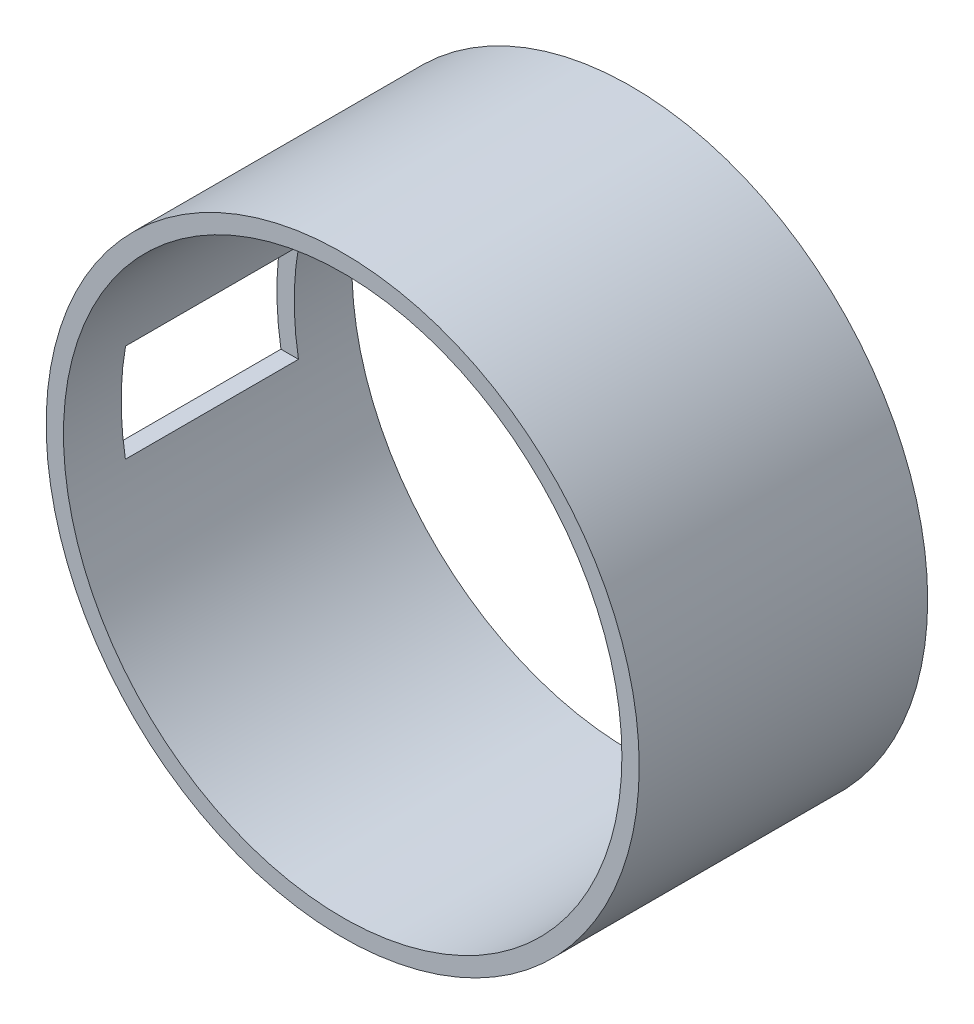
ISO-10303-21;
HEADER;
FILE_DESCRIPTION(('STEP AP214'),'2;1');
FILE_NAME('part.step','',(''),(''),'','','');
FILE_SCHEMA(('AUTOMOTIVE_DESIGN { 1 0 10303 214 1 1 1 1 }'));
ENDSEC;
DATA;
#1=APPLICATION_CONTEXT('core data for automotive mechanical design processes');
#2=APPLICATION_PROTOCOL_DEFINITION('international standard','automotive_design',2000,#1);
#3=PRODUCT_CONTEXT('',#1,'mechanical');
#4=PRODUCT('Part','Part','',(#3));
#5=PRODUCT_RELATED_PRODUCT_CATEGORY('part','',(#4));
#6=PRODUCT_DEFINITION_FORMATION('','',#4);
#7=PRODUCT_DEFINITION_CONTEXT('part definition',#1,'design');
#8=PRODUCT_DEFINITION('design','',#6,#7);
#9=PRODUCT_DEFINITION_SHAPE('','',#8);
#10=(LENGTH_UNIT() NAMED_UNIT(*) SI_UNIT(.MILLI.,.METRE.));
#11=(NAMED_UNIT(*) PLANE_ANGLE_UNIT() SI_UNIT($,.RADIAN.));
#12=(NAMED_UNIT(*) SI_UNIT($,.STERADIAN.) SOLID_ANGLE_UNIT());
#13=UNCERTAINTY_MEASURE_WITH_UNIT(LENGTH_MEASURE(1.E-05),#10,'distance_accuracy_value','');
#14=(GEOMETRIC_REPRESENTATION_CONTEXT(3) GLOBAL_UNCERTAINTY_ASSIGNED_CONTEXT((#13)) GLOBAL_UNIT_ASSIGNED_CONTEXT((#10,
#11,#12)) REPRESENTATION_CONTEXT('',''));
#15=CARTESIAN_POINT('',(0.,0.,0.));
#16=DIRECTION('',(0.,0.,1.));
#17=DIRECTION('',(1.,0.,0.));
#18=AXIS2_PLACEMENT_3D('',#15,#16,#17);
#19=CARTESIAN_POINT('',(0.,0.,10.));
#20=DIRECTION('',(0.,0.,1.));
#21=DIRECTION('',(1.,0.,0.));
#22=AXIS2_PLACEMENT_3D('',#19,#20,#21);
#23=PLANE('',#22);
#24=CARTESIAN_POINT('',(0.,0.,10.));
#25=DIRECTION('',(0.,0.,1.));
#26=DIRECTION('',(1.,0.,0.));
#27=AXIS2_PLACEMENT_3D('',#24,#25,#26);
#28=CIRCLE('',#27,10.28);
#29=CARTESIAN_POINT('',(10.28,0.,10.));
#30=VERTEX_POINT('',#29);
#31=EDGE_CURVE('E91',#30,#30,#28,.T.);
#32=ORIENTED_EDGE('',*,*,#31,.T.);
#33=EDGE_LOOP('',(#32));
#34=FACE_BOUND('',#33,.T.);
#35=CARTESIAN_POINT('',(0.,0.,10.));
#36=DIRECTION('',(0.,0.,1.));
#37=DIRECTION('',(1.,0.,0.));
#38=AXIS2_PLACEMENT_3D('',#35,#36,#37);
#39=CIRCLE('',#38,9.68);
#40=CARTESIAN_POINT('',(9.68,0.,10.));
#41=VERTEX_POINT('',#40);
#42=EDGE_CURVE('E115',#41,#41,#39,.T.);
#43=ORIENTED_EDGE('',*,*,#42,.F.);
#44=EDGE_LOOP('',(#43));
#45=FACE_BOUND('',#44,.T.);
#46=ADVANCED_FACE('F45',(#34,#45),#23,.T.);
#47=CARTESIAN_POINT('',(0.,0.,0.));
#48=DIRECTION('',(0.,0.,1.));
#49=DIRECTION('',(1.,0.,0.));
#50=AXIS2_PLACEMENT_3D('',#47,#48,#49);
#51=PLANE('',#50);
#52=CARTESIAN_POINT('',(0.,0.,0.));
#53=DIRECTION('',(0.,0.,1.));
#54=DIRECTION('',(1.,0.,0.));
#55=AXIS2_PLACEMENT_3D('',#52,#53,#54);
#56=CIRCLE('',#55,10.28);
#57=CARTESIAN_POINT('',(10.28,0.,0.));
#58=VERTEX_POINT('',#57);
#59=EDGE_CURVE('E111',#58,#58,#56,.T.);
#60=ORIENTED_EDGE('',*,*,#59,.F.);
#61=EDGE_LOOP('',(#60));
#62=FACE_BOUND('',#61,.T.);
#63=CARTESIAN_POINT('',(0.,0.,0.));
#64=DIRECTION('',(0.,0.,1.));
#65=DIRECTION('',(1.,0.,0.));
#66=AXIS2_PLACEMENT_3D('',#63,#64,#65);
#67=CIRCLE('',#66,9.68);
#68=CARTESIAN_POINT('',(9.68,0.,0.));
#69=VERTEX_POINT('',#68);
#70=EDGE_CURVE('E119',#69,#69,#67,.T.);
#71=ORIENTED_EDGE('',*,*,#70,.T.);
#72=EDGE_LOOP('',(#71));
#73=FACE_BOUND('',#72,.T.);
#74=ADVANCED_FACE('F160',(#62,#73),#51,.F.);
#75=CARTESIAN_POINT('',(0.,0.,10.));
#76=DIRECTION('',(0.,0.,-1.));
#77=DIRECTION('',(-1.,0.,0.));
#78=AXIS2_PLACEMENT_3D('',#75,#76,#77);
#79=CYLINDRICAL_SURFACE('',#78,10.28);
#80=DIRECTION('',(0.,0.,-1.));
#81=VECTOR('',#80,1.);
#82=CARTESIAN_POINT('',(-10.1359616319165,1.71484162426612,10.));
#83=LINE('',#82,#81);
#84=CARTESIAN_POINT('',(-10.1359616319165,1.71484162426612,2.));
#85=VERTEX_POINT('',#84);
#86=CARTESIAN_POINT('',(-10.1359616319165,1.71484162426612,8.));
#87=VERTEX_POINT('',#86);
#88=EDGE_CURVE('E128',#85,#87,#83,.F.);
#89=ORIENTED_EDGE('',*,*,#88,.T.);
#90=CARTESIAN_POINT('',(0.,0.,8.));
#91=DIRECTION('',(0.,0.,1.));
#92=DIRECTION('',(1.,0.,0.));
#93=AXIS2_PLACEMENT_3D('',#90,#91,#92);
#94=CIRCLE('',#93,10.28);
#95=CARTESIAN_POINT('',(-10.1409388741227,-1.68515837573388,8.));
#96=VERTEX_POINT('',#95);
#97=EDGE_CURVE('E132',#87,#96,#94,.T.);
#98=ORIENTED_EDGE('',*,*,#97,.T.);
#99=DIRECTION('',(0.,0.,-1.));
#100=VECTOR('',#99,1.);
#101=CARTESIAN_POINT('',(-10.1409388741227,-1.68515837573388,10.));
#102=LINE('',#101,#100);
#103=CARTESIAN_POINT('',(-10.1409388741227,-1.68515837573388,2.));
#104=VERTEX_POINT('',#103);
#105=EDGE_CURVE('E135',#96,#104,#102,.T.);
#106=ORIENTED_EDGE('',*,*,#105,.T.);
#107=CARTESIAN_POINT('',(0.,0.,2.));
#108=DIRECTION('',(0.,0.,-1.));
#109=DIRECTION('',(0.,1.,0.));
#110=AXIS2_PLACEMENT_3D('',#107,#108,#109);
#111=CIRCLE('',#110,10.28);
#112=EDGE_CURVE('E97',#104,#85,#111,.T.);
#113=ORIENTED_EDGE('',*,*,#112,.T.);
#114=EDGE_LOOP('',(#89,#98,#106,#113));
#115=FACE_BOUND('',#114,.T.);
#116=ORIENTED_EDGE('',*,*,#31,.F.);
#117=EDGE_LOOP('',(#116));
#118=FACE_BOUND('',#117,.T.);
#119=ORIENTED_EDGE('',*,*,#59,.T.);
#120=EDGE_LOOP('',(#119));
#121=FACE_BOUND('',#120,.T.);
#122=ADVANCED_FACE('F47',(#115,#118,#121),#79,.T.);
#123=CARTESIAN_POINT('',(0.,0.,10.));
#124=DIRECTION('',(0.,0.,-1.));
#125=DIRECTION('',(-1.,0.,0.));
#126=AXIS2_PLACEMENT_3D('',#123,#124,#125);
#127=CYLINDRICAL_SURFACE('',#126,9.68);
#128=CARTESIAN_POINT('',(0.,0.,2.));
#129=DIRECTION('',(0.,0.,-1.));
#130=DIRECTION('',(0.,1.,0.));
#131=AXIS2_PLACEMENT_3D('',#128,#129,#130);
#132=CIRCLE('',#131,9.68);
#133=CARTESIAN_POINT('',(-9.53218974048954,-1.68515837573388,2.));
#134=VERTEX_POINT('',#133);
#135=CARTESIAN_POINT('',(-9.52689446796197,1.71484162426612,2.));
#136=VERTEX_POINT('',#135);
#137=EDGE_CURVE('E11',#134,#136,#132,.T.);
#138=ORIENTED_EDGE('',*,*,#137,.F.);
#139=DIRECTION('',(0.,0.,-1.));
#140=VECTOR('',#139,1.);
#141=CARTESIAN_POINT('',(-9.53218974048954,-1.68515837573388,10.));
#142=LINE('',#141,#140);
#143=CARTESIAN_POINT('',(-9.53218974048954,-1.68515837573388,8.));
#144=VERTEX_POINT('',#143);
#145=EDGE_CURVE('E84',#144,#134,#142,.T.);
#146=ORIENTED_EDGE('',*,*,#145,.F.);
#147=CARTESIAN_POINT('',(0.,0.,8.));
#148=DIRECTION('',(0.,0.,1.));
#149=DIRECTION('',(1.,0.,0.));
#150=AXIS2_PLACEMENT_3D('',#147,#148,#149);
#151=CIRCLE('',#150,9.68);
#152=CARTESIAN_POINT('',(-9.52689446796197,1.71484162426612,8.));
#153=VERTEX_POINT('',#152);
#154=EDGE_CURVE('E90',#153,#144,#151,.T.);
#155=ORIENTED_EDGE('',*,*,#154,.F.);
#156=DIRECTION('',(0.,0.,-1.));
#157=VECTOR('',#156,1.);
#158=CARTESIAN_POINT('',(-9.52689446796197,1.71484162426612,10.));
#159=LINE('',#158,#157);
#160=EDGE_CURVE('E54',#136,#153,#159,.F.);
#161=ORIENTED_EDGE('',*,*,#160,.F.);
#162=EDGE_LOOP('',(#138,#146,#155,#161));
#163=FACE_BOUND('',#162,.T.);
#164=ORIENTED_EDGE('',*,*,#42,.T.);
#165=EDGE_LOOP('',(#164));
#166=FACE_BOUND('',#165,.T.);
#167=ORIENTED_EDGE('',*,*,#70,.F.);
#168=EDGE_LOOP('',(#167));
#169=FACE_BOUND('',#168,.T.);
#170=ADVANCED_FACE('F102',(#163,#166,#169),#127,.F.);
#171=CARTESIAN_POINT('',(-8.78,1.71484162426612,2.));
#172=DIRECTION('',(0.,0.,-1.));
#173=DIRECTION('',(0.,1.,0.));
#174=AXIS2_PLACEMENT_3D('',#171,#172,#173);
#175=PLANE('',#174);
#176=DIRECTION('',(-1.,0.,0.));
#177=VECTOR('',#176,1.);
#178=CARTESIAN_POINT('',(-8.78,-1.68515837573388,2.));
#179=LINE('',#178,#177);
#180=EDGE_CURVE('E61',#134,#104,#179,.T.);
#181=ORIENTED_EDGE('',*,*,#180,.F.);
#182=ORIENTED_EDGE('',*,*,#137,.T.);
#183=DIRECTION('',(-1.,0.,0.));
#184=VECTOR('',#183,1.);
#185=CARTESIAN_POINT('',(-8.78,1.71484162426612,2.));
#186=LINE('',#185,#184);
#187=EDGE_CURVE('E137',#136,#85,#186,.T.);
#188=ORIENTED_EDGE('',*,*,#187,.T.);
#189=ORIENTED_EDGE('',*,*,#112,.F.);
#190=EDGE_LOOP('',(#181,#182,#188,#189));
#191=FACE_BOUND('',#190,.T.);
#192=ADVANCED_FACE('F94',(#191),#175,.F.);
#193=CARTESIAN_POINT('',(-8.78,1.71484162426612,2.));
#194=DIRECTION('',(0.,1.,0.));
#195=DIRECTION('',(0.,0.,1.));
#196=AXIS2_PLACEMENT_3D('',#193,#194,#195);
#197=PLANE('',#196);
#198=ORIENTED_EDGE('',*,*,#187,.F.);
#199=ORIENTED_EDGE('',*,*,#160,.T.);
#200=DIRECTION('',(-1.,0.,0.));
#201=VECTOR('',#200,1.);
#202=CARTESIAN_POINT('',(-8.78,1.71484162426612,8.));
#203=LINE('',#202,#201);
#204=EDGE_CURVE('E141',#153,#87,#203,.T.);
#205=ORIENTED_EDGE('',*,*,#204,.T.);
#206=ORIENTED_EDGE('',*,*,#88,.F.);
#207=EDGE_LOOP('',(#198,#199,#205,#206));
#208=FACE_BOUND('',#207,.T.);
#209=ADVANCED_FACE('F146',(#208),#197,.F.);
#210=CARTESIAN_POINT('',(-8.78,1.71484162426612,8.));
#211=DIRECTION('',(0.,0.,1.));
#212=DIRECTION('',(1.,0.,0.));
#213=AXIS2_PLACEMENT_3D('',#210,#211,#212);
#214=PLANE('',#213);
#215=ORIENTED_EDGE('',*,*,#204,.F.);
#216=ORIENTED_EDGE('',*,*,#154,.T.);
#217=DIRECTION('',(-1.,0.,0.));
#218=VECTOR('',#217,1.);
#219=CARTESIAN_POINT('',(-8.78,-1.68515837573388,8.));
#220=LINE('',#219,#218);
#221=EDGE_CURVE('E66',#144,#96,#220,.T.);
#222=ORIENTED_EDGE('',*,*,#221,.T.);
#223=ORIENTED_EDGE('',*,*,#97,.F.);
#224=EDGE_LOOP('',(#215,#216,#222,#223));
#225=FACE_BOUND('',#224,.T.);
#226=ADVANCED_FACE('F150',(#225),#214,.F.);
#227=CARTESIAN_POINT('',(-8.78,-1.68515837573388,2.));
#228=DIRECTION('',(0.,-1.,0.));
#229=DIRECTION('',(0.,0.,-1.));
#230=AXIS2_PLACEMENT_3D('',#227,#228,#229);
#231=PLANE('',#230);
#232=ORIENTED_EDGE('',*,*,#221,.F.);
#233=ORIENTED_EDGE('',*,*,#145,.T.);
#234=ORIENTED_EDGE('',*,*,#180,.T.);
#235=ORIENTED_EDGE('',*,*,#105,.F.);
#236=EDGE_LOOP('',(#232,#233,#234,#235));
#237=FACE_BOUND('',#236,.T.);
#238=ADVANCED_FACE('F85',(#237),#231,.F.);
#239=CLOSED_SHELL('',(#46,#74,#122,#170,#192,#209,#226,#238));
#240=MANIFOLD_SOLID_BREP('B2',#239);
#241=ADVANCED_BREP_SHAPE_REPRESENTATION('',(#18,#240),#14);
#242=SHAPE_DEFINITION_REPRESENTATION(#9,#241);
ENDSEC;
END-ISO-10303-21;
